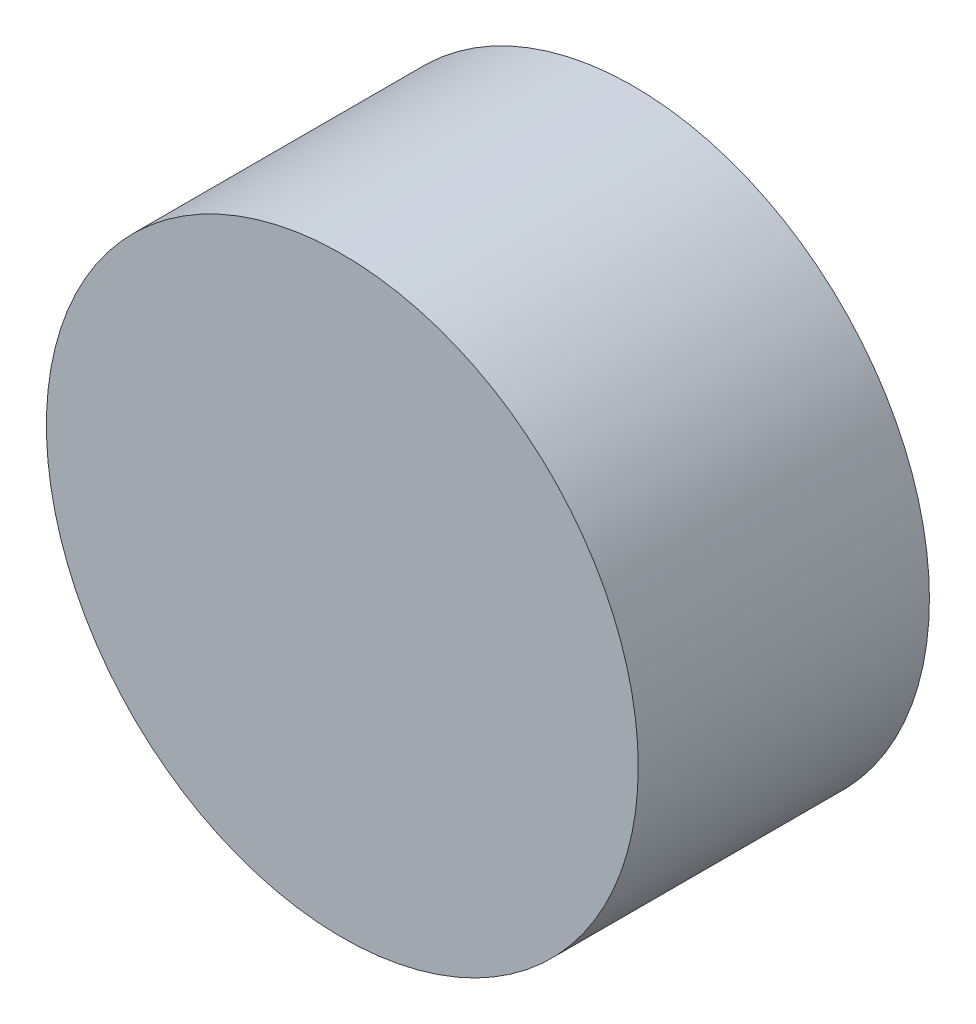
ISO-10303-21;
HEADER;
FILE_DESCRIPTION(('STEP AP214'),'2;1');
FILE_NAME('part.step','',(''),(''),'','','');
FILE_SCHEMA(('AUTOMOTIVE_DESIGN { 1 0 10303 214 1 1 1 1 }'));
ENDSEC;
DATA;
#1=APPLICATION_CONTEXT('core data for automotive mechanical design processes');
#2=APPLICATION_PROTOCOL_DEFINITION('international standard','automotive_design',2000,#1);
#3=PRODUCT_CONTEXT('',#1,'mechanical');
#4=PRODUCT('Part','Part','',(#3));
#5=PRODUCT_RELATED_PRODUCT_CATEGORY('part','',(#4));
#6=PRODUCT_DEFINITION_FORMATION('','',#4);
#7=PRODUCT_DEFINITION_CONTEXT('part definition',#1,'design');
#8=PRODUCT_DEFINITION('design','',#6,#7);
#9=PRODUCT_DEFINITION_SHAPE('','',#8);
#10=(LENGTH_UNIT() NAMED_UNIT(*) SI_UNIT(.MILLI.,.METRE.));
#11=(NAMED_UNIT(*) PLANE_ANGLE_UNIT() SI_UNIT($,.RADIAN.));
#12=(NAMED_UNIT(*) SI_UNIT($,.STERADIAN.) SOLID_ANGLE_UNIT());
#13=UNCERTAINTY_MEASURE_WITH_UNIT(LENGTH_MEASURE(1.E-05),#10,'distance_accuracy_value','');
#14=(GEOMETRIC_REPRESENTATION_CONTEXT(3) GLOBAL_UNCERTAINTY_ASSIGNED_CONTEXT((#13)) GLOBAL_UNIT_ASSIGNED_CONTEXT((#10,
#11,#12)) REPRESENTATION_CONTEXT('',''));
#15=CARTESIAN_POINT('',(0.,0.,0.));
#16=DIRECTION('',(0.,0.,1.));
#17=DIRECTION('',(1.,0.,0.));
#18=AXIS2_PLACEMENT_3D('',#15,#16,#17);
#19=CARTESIAN_POINT('',(0.,0.,24.6));
#20=DIRECTION('',(0.,0.,-1.));
#21=DIRECTION('',(-1.,0.,0.));
#22=AXIS2_PLACEMENT_3D('',#19,#20,#21);
#23=CYLINDRICAL_SURFACE('',#22,25.);
#24=CARTESIAN_POINT('',(0.,0.,24.6));
#25=DIRECTION('',(0.,0.,1.));
#26=DIRECTION('',(1.,0.,0.));
#27=AXIS2_PLACEMENT_3D('',#24,#25,#26);
#28=CIRCLE('',#27,25.);
#29=CARTESIAN_POINT('',(25.,0.,24.6));
#30=VERTEX_POINT('',#29);
#31=EDGE_CURVE('E10',#30,#30,#28,.T.);
#32=ORIENTED_EDGE('',*,*,#31,.F.);
#33=EDGE_LOOP('',(#32));
#34=FACE_BOUND('',#33,.T.);
#35=CARTESIAN_POINT('',(0.,0.,0.));
#36=DIRECTION('',(0.,0.,1.));
#37=DIRECTION('',(1.,0.,0.));
#38=AXIS2_PLACEMENT_3D('',#35,#36,#37);
#39=CIRCLE('',#38,25.);
#40=CARTESIAN_POINT('',(25.,0.,0.));
#41=VERTEX_POINT('',#40);
#42=EDGE_CURVE('E40',#41,#41,#39,.T.);
#43=ORIENTED_EDGE('',*,*,#42,.T.);
#44=EDGE_LOOP('',(#43));
#45=FACE_BOUND('',#44,.T.);
#46=ADVANCED_FACE('F37',(#34,#45),#23,.T.);
#47=CARTESIAN_POINT('',(0.,0.,24.6));
#48=DIRECTION('',(0.,0.,1.));
#49=DIRECTION('',(1.,0.,0.));
#50=AXIS2_PLACEMENT_3D('',#47,#48,#49);
#51=PLANE('',#50);
#52=ORIENTED_EDGE('',*,*,#31,.T.);
#53=EDGE_LOOP('',(#52));
#54=FACE_BOUND('',#53,.T.);
#55=ADVANCED_FACE('F54',(#54),#51,.T.);
#56=CARTESIAN_POINT('',(0.,0.,0.));
#57=DIRECTION('',(0.,0.,1.));
#58=DIRECTION('',(1.,0.,0.));
#59=AXIS2_PLACEMENT_3D('',#56,#57,#58);
#60=PLANE('',#59);
#61=ORIENTED_EDGE('',*,*,#42,.F.);
#62=EDGE_LOOP('',(#61));
#63=FACE_BOUND('',#62,.T.);
#64=ADVANCED_FACE('F52',(#63),#60,.F.);
#65=CLOSED_SHELL('',(#46,#55,#64));
#66=MANIFOLD_SOLID_BREP('B2',#65);
#67=ADVANCED_BREP_SHAPE_REPRESENTATION('',(#18,#66),#14);
#68=SHAPE_DEFINITION_REPRESENTATION(#9,#67);
ENDSEC;
END-ISO-10303-21;
